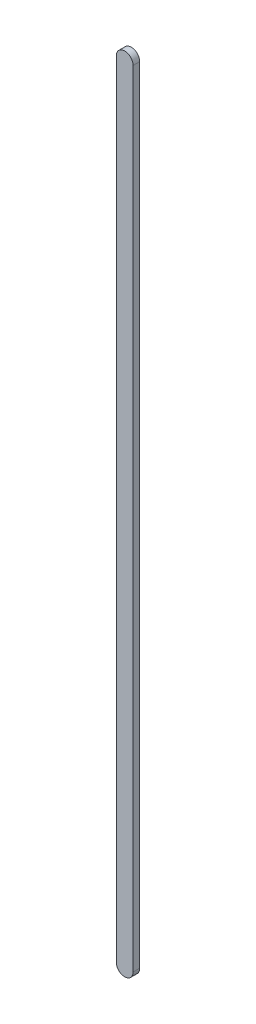
ISO-10303-21;
HEADER;
FILE_DESCRIPTION(('STEP AP214'),'2;1');
FILE_NAME('part.step','',(''),(''),'','','');
FILE_SCHEMA(('AUTOMOTIVE_DESIGN { 1 0 10303 214 1 1 1 1 }'));
ENDSEC;
DATA;
#1=APPLICATION_CONTEXT('core data for automotive mechanical design processes');
#2=APPLICATION_PROTOCOL_DEFINITION('international standard','automotive_design',2000,#1);
#3=PRODUCT_CONTEXT('',#1,'mechanical');
#4=PRODUCT('Part','Part','',(#3));
#5=PRODUCT_RELATED_PRODUCT_CATEGORY('part','',(#4));
#6=PRODUCT_DEFINITION_FORMATION('','',#4);
#7=PRODUCT_DEFINITION_CONTEXT('part definition',#1,'design');
#8=PRODUCT_DEFINITION('design','',#6,#7);
#9=PRODUCT_DEFINITION_SHAPE('','',#8);
#10=(LENGTH_UNIT() NAMED_UNIT(*) SI_UNIT(.MILLI.,.METRE.));
#11=(NAMED_UNIT(*) PLANE_ANGLE_UNIT() SI_UNIT($,.RADIAN.));
#12=(NAMED_UNIT(*) SI_UNIT($,.STERADIAN.) SOLID_ANGLE_UNIT());
#13=UNCERTAINTY_MEASURE_WITH_UNIT(LENGTH_MEASURE(1.E-05),#10,'distance_accuracy_value','');
#14=(GEOMETRIC_REPRESENTATION_CONTEXT(3) GLOBAL_UNCERTAINTY_ASSIGNED_CONTEXT((#13)) GLOBAL_UNIT_ASSIGNED_CONTEXT((#10,
#11,#12)) REPRESENTATION_CONTEXT('',''));
#15=CARTESIAN_POINT('',(0.,0.,0.));
#16=DIRECTION('',(0.,0.,1.));
#17=DIRECTION('',(1.,0.,0.));
#18=AXIS2_PLACEMENT_3D('',#15,#16,#17);
#19=CARTESIAN_POINT('',(106.7308,69.596,0.));
#20=DIRECTION('',(-1.,0.,0.));
#21=DIRECTION('',(0.,1.,0.));
#22=AXIS2_PLACEMENT_3D('',#19,#20,#21);
#23=PLANE('',#22);
#24=DIRECTION('',(0.,1.,0.));
#25=VECTOR('',#24,1.);
#26=CARTESIAN_POINT('',(106.7308,69.596,0.1999996));
#27=LINE('',#26,#25);
#28=CARTESIAN_POINT('',(106.7308,69.596,0.1999996));
#29=VERTEX_POINT('',#28);
#30=CARTESIAN_POINT('',(106.7308,93.3928028,0.1999996));
#31=VERTEX_POINT('',#30);
#32=EDGE_CURVE('E11',#29,#31,#27,.T.);
#33=ORIENTED_EDGE('',*,*,#32,.F.);
#34=DIRECTION('',(0.,0.,1.));
#35=VECTOR('',#34,1.);
#36=CARTESIAN_POINT('',(106.7308,69.596,0.));
#37=LINE('',#36,#35);
#38=CARTESIAN_POINT('',(106.7308,69.596,0.));
#39=VERTEX_POINT('',#38);
#40=EDGE_CURVE('E24',#39,#29,#37,.T.);
#41=ORIENTED_EDGE('',*,*,#40,.F.);
#42=DIRECTION('',(0.,1.,0.));
#43=VECTOR('',#42,1.);
#44=CARTESIAN_POINT('',(106.7308,69.596,0.));
#45=LINE('',#44,#43);
#46=CARTESIAN_POINT('',(106.7308,93.3928028,0.));
#47=VERTEX_POINT('',#46);
#48=EDGE_CURVE('E75',#39,#47,#45,.T.);
#49=ORIENTED_EDGE('',*,*,#48,.T.);
#50=DIRECTION('',(0.,0.,1.));
#51=VECTOR('',#50,1.);
#52=CARTESIAN_POINT('',(106.7308,93.3928028,0.));
#53=LINE('',#52,#51);
#54=EDGE_CURVE('E37',#47,#31,#53,.T.);
#55=ORIENTED_EDGE('',*,*,#54,.T.);
#56=EDGE_LOOP('',(#33,#41,#49,#55));
#57=FACE_BOUND('',#56,.T.);
#58=ADVANCED_FACE('F17',(#57),#23,.F.);
#59=CARTESIAN_POINT('',(106.4768,93.3928028,0.));
#60=DIRECTION('',(0.,0.,-1.));
#61=DIRECTION('',(1.,0.,0.));
#62=AXIS2_PLACEMENT_3D('',#59,#60,#61);
#63=CYLINDRICAL_SURFACE('',#62,0.254);
#64=CARTESIAN_POINT('',(106.4768,93.3928028,0.1999996));
#65=DIRECTION('',(0.,0.,1.));
#66=DIRECTION('',(1.,0.,0.));
#67=AXIS2_PLACEMENT_3D('',#64,#65,#66);
#68=CIRCLE('',#67,0.254);
#69=CARTESIAN_POINT('',(106.2228,93.3928028,0.1999996));
#70=VERTEX_POINT('',#69);
#71=EDGE_CURVE('E83',#31,#70,#68,.T.);
#72=ORIENTED_EDGE('',*,*,#71,.F.);
#73=ORIENTED_EDGE('',*,*,#54,.F.);
#74=CARTESIAN_POINT('',(106.4768,93.3928028,0.));
#75=DIRECTION('',(0.,0.,1.));
#76=DIRECTION('',(1.,0.,0.));
#77=AXIS2_PLACEMENT_3D('',#74,#75,#76);
#78=CIRCLE('',#77,0.254);
#79=CARTESIAN_POINT('',(106.2228,93.3928028,0.));
#80=VERTEX_POINT('',#79);
#81=EDGE_CURVE('E81',#47,#80,#78,.T.);
#82=ORIENTED_EDGE('',*,*,#81,.T.);
#83=DIRECTION('',(0.,0.,1.));
#84=VECTOR('',#83,1.);
#85=CARTESIAN_POINT('',(106.2228,93.3928028,0.));
#86=LINE('',#85,#84);
#87=EDGE_CURVE('E67',#80,#70,#86,.T.);
#88=ORIENTED_EDGE('',*,*,#87,.T.);
#89=EDGE_LOOP('',(#72,#73,#82,#88));
#90=FACE_BOUND('',#89,.T.);
#91=ADVANCED_FACE('F89',(#90),#63,.T.);
#92=CARTESIAN_POINT('',(106.2228,93.3928028,0.));
#93=DIRECTION('',(1.,0.,0.));
#94=DIRECTION('',(0.,-1.,0.));
#95=AXIS2_PLACEMENT_3D('',#92,#93,#94);
#96=PLANE('',#95);
#97=DIRECTION('',(0.,-1.,0.));
#98=VECTOR('',#97,1.);
#99=CARTESIAN_POINT('',(106.2228,93.3928028,0.1999996));
#100=LINE('',#99,#98);
#101=CARTESIAN_POINT('',(106.2228,69.596,0.1999996));
#102=VERTEX_POINT('',#101);
#103=EDGE_CURVE('E71',#70,#102,#100,.T.);
#104=ORIENTED_EDGE('',*,*,#103,.F.);
#105=ORIENTED_EDGE('',*,*,#87,.F.);
#106=DIRECTION('',(0.,-1.,0.));
#107=VECTOR('',#106,1.);
#108=CARTESIAN_POINT('',(106.2228,93.3928028,0.));
#109=LINE('',#108,#107);
#110=CARTESIAN_POINT('',(106.2228,69.596,0.));
#111=VERTEX_POINT('',#110);
#112=EDGE_CURVE('E63',#80,#111,#109,.T.);
#113=ORIENTED_EDGE('',*,*,#112,.T.);
#114=DIRECTION('',(0.,0.,1.));
#115=VECTOR('',#114,1.);
#116=CARTESIAN_POINT('',(106.2228,69.596,0.));
#117=LINE('',#116,#115);
#118=EDGE_CURVE('E53',#111,#102,#117,.T.);
#119=ORIENTED_EDGE('',*,*,#118,.T.);
#120=EDGE_LOOP('',(#104,#105,#113,#119));
#121=FACE_BOUND('',#120,.T.);
#122=ADVANCED_FACE('F66',(#121),#96,.F.);
#123=CARTESIAN_POINT('',(106.4768,69.596,0.));
#124=DIRECTION('',(0.,0.,-1.));
#125=DIRECTION('',(-1.,0.,0.));
#126=AXIS2_PLACEMENT_3D('',#123,#124,#125);
#127=CYLINDRICAL_SURFACE('',#126,0.253999999999995);
#128=CARTESIAN_POINT('',(106.4768,69.596,0.1999996));
#129=DIRECTION('',(0.,0.,1.));
#130=DIRECTION('',(-1.,0.,0.));
#131=AXIS2_PLACEMENT_3D('',#128,#129,#130);
#132=CIRCLE('',#131,0.253999999999995);
#133=EDGE_CURVE('E59',#102,#29,#132,.T.);
#134=ORIENTED_EDGE('',*,*,#133,.F.);
#135=ORIENTED_EDGE('',*,*,#118,.F.);
#136=CARTESIAN_POINT('',(106.4768,69.596,0.));
#137=DIRECTION('',(0.,0.,1.));
#138=DIRECTION('',(-1.,0.,0.));
#139=AXIS2_PLACEMENT_3D('',#136,#137,#138);
#140=CIRCLE('',#139,0.253999999999995);
#141=EDGE_CURVE('E57',#111,#39,#140,.T.);
#142=ORIENTED_EDGE('',*,*,#141,.T.);
#143=ORIENTED_EDGE('',*,*,#40,.T.);
#144=EDGE_LOOP('',(#134,#135,#142,#143));
#145=FACE_BOUND('',#144,.T.);
#146=ADVANCED_FACE('F55',(#145),#127,.T.);
#147=CARTESIAN_POINT('',(106.7308,69.596,0.));
#148=DIRECTION('',(0.,0.,-1.));
#149=DIRECTION('',(-1.,0.,0.));
#150=AXIS2_PLACEMENT_3D('',#147,#148,#149);
#151=PLANE('',#150);
#152=ORIENTED_EDGE('',*,*,#141,.F.);
#153=ORIENTED_EDGE('',*,*,#112,.F.);
#154=ORIENTED_EDGE('',*,*,#81,.F.);
#155=ORIENTED_EDGE('',*,*,#48,.F.);
#156=EDGE_LOOP('',(#152,#153,#154,#155));
#157=FACE_BOUND('',#156,.T.);
#158=ADVANCED_FACE('F74',(#157),#151,.T.);
#159=CARTESIAN_POINT('',(106.7308,69.596,0.1999996));
#160=DIRECTION('',(0.,0.,-1.));
#161=DIRECTION('',(-1.,0.,0.));
#162=AXIS2_PLACEMENT_3D('',#159,#160,#161);
#163=PLANE('',#162);
#164=ORIENTED_EDGE('',*,*,#32,.T.);
#165=ORIENTED_EDGE('',*,*,#71,.T.);
#166=ORIENTED_EDGE('',*,*,#103,.T.);
#167=ORIENTED_EDGE('',*,*,#133,.T.);
#168=EDGE_LOOP('',(#164,#165,#166,#167));
#169=FACE_BOUND('',#168,.T.);
#170=ADVANCED_FACE('F91',(#169),#163,.F.);
#171=CLOSED_SHELL('',(#58,#91,#122,#146,#158,#170));
#172=MANIFOLD_SOLID_BREP('B1',#171);
#173=ADVANCED_BREP_SHAPE_REPRESENTATION('',(#18,#172),#14);
#174=SHAPE_DEFINITION_REPRESENTATION(#9,#173);
ENDSEC;
END-ISO-10303-21;
